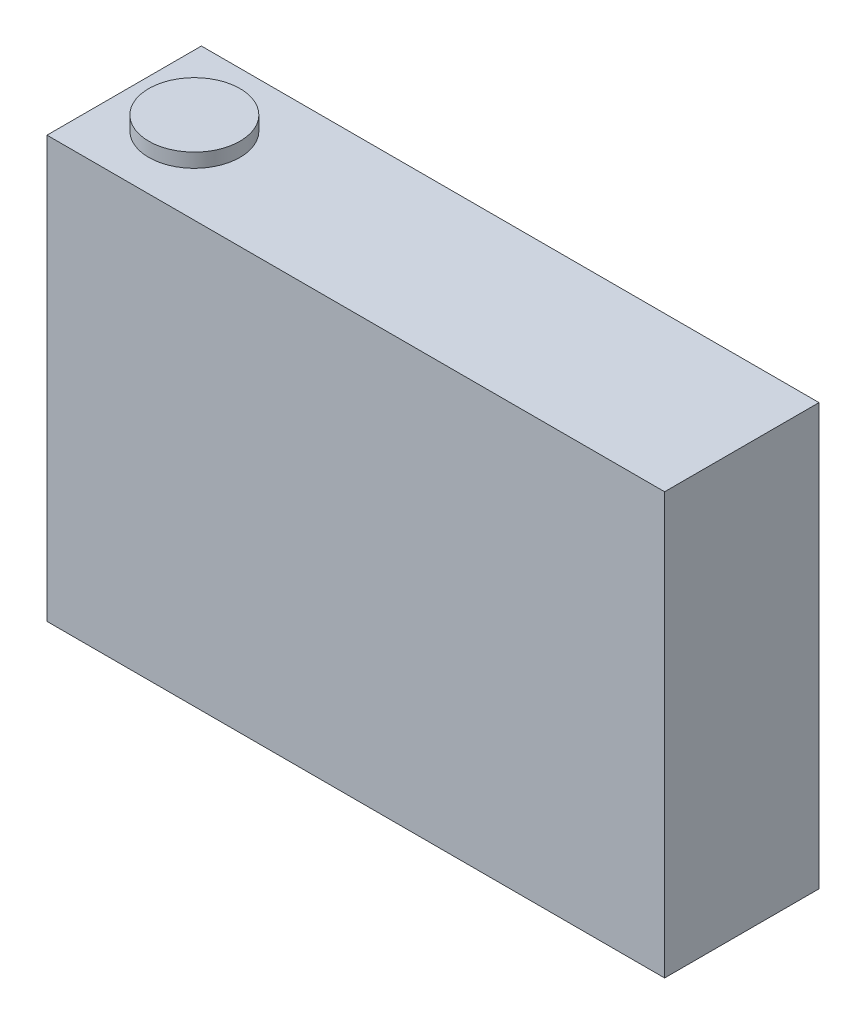
ISO-10303-21;
HEADER;
FILE_DESCRIPTION(('STEP AP214'),'2;1');
FILE_NAME('part.step','',(''),(''),'','','');
FILE_SCHEMA(('AUTOMOTIVE_DESIGN { 1 0 10303 214 1 1 1 1 }'));
ENDSEC;
DATA;
#1=APPLICATION_CONTEXT('core data for automotive mechanical design processes');
#2=APPLICATION_PROTOCOL_DEFINITION('international standard','automotive_design',2000,#1);
#3=PRODUCT_CONTEXT('',#1,'mechanical');
#4=PRODUCT('Part','Part','',(#3));
#5=PRODUCT_RELATED_PRODUCT_CATEGORY('part','',(#4));
#6=PRODUCT_DEFINITION_FORMATION('','',#4);
#7=PRODUCT_DEFINITION_CONTEXT('part definition',#1,'design');
#8=PRODUCT_DEFINITION('design','',#6,#7);
#9=PRODUCT_DEFINITION_SHAPE('','',#8);
#10=(LENGTH_UNIT() NAMED_UNIT(*) SI_UNIT(.MILLI.,.METRE.));
#11=(NAMED_UNIT(*) PLANE_ANGLE_UNIT() SI_UNIT($,.RADIAN.));
#12=(NAMED_UNIT(*) SI_UNIT($,.STERADIAN.) SOLID_ANGLE_UNIT());
#13=UNCERTAINTY_MEASURE_WITH_UNIT(LENGTH_MEASURE(1.E-05),#10,'distance_accuracy_value','');
#14=(GEOMETRIC_REPRESENTATION_CONTEXT(3) GLOBAL_UNCERTAINTY_ASSIGNED_CONTEXT((#13)) GLOBAL_UNIT_ASSIGNED_CONTEXT((#10,
#11,#12)) REPRESENTATION_CONTEXT('',''));
#15=CARTESIAN_POINT('',(0.,0.,0.));
#16=DIRECTION('',(0.,0.,1.));
#17=DIRECTION('',(1.,0.,0.));
#18=AXIS2_PLACEMENT_3D('',#15,#16,#17);
#19=CARTESIAN_POINT('',(0.,60.,0.));
#20=DIRECTION('',(0.,-1.,0.));
#21=DIRECTION('',(0.,0.,-1.));
#22=AXIS2_PLACEMENT_3D('',#19,#20,#21);
#23=PLANE('',#22);
#24=DIRECTION('',(0.,0.,-1.));
#25=VECTOR('',#24,1.);
#26=CARTESIAN_POINT('',(44.,60.,11.));
#27=LINE('',#26,#25);
#28=CARTESIAN_POINT('',(44.,60.,11.));
#29=VERTEX_POINT('',#28);
#30=CARTESIAN_POINT('',(44.,60.,-11.));
#31=VERTEX_POINT('',#30);
#32=EDGE_CURVE('E97',#29,#31,#27,.T.);
#33=ORIENTED_EDGE('',*,*,#32,.T.);
#34=DIRECTION('',(-1.,0.,0.));
#35=VECTOR('',#34,1.);
#36=CARTESIAN_POINT('',(-44.,60.,-11.));
#37=LINE('',#36,#35);
#38=CARTESIAN_POINT('',(-44.,60.,-11.));
#39=VERTEX_POINT('',#38);
#40=EDGE_CURVE('E93',#31,#39,#37,.T.);
#41=ORIENTED_EDGE('',*,*,#40,.T.);
#42=DIRECTION('',(0.,0.,1.));
#43=VECTOR('',#42,1.);
#44=CARTESIAN_POINT('',(-44.,60.,11.));
#45=LINE('',#44,#43);
#46=CARTESIAN_POINT('',(-44.,60.,11.));
#47=VERTEX_POINT('',#46);
#48=EDGE_CURVE('E96',#39,#47,#45,.T.);
#49=ORIENTED_EDGE('',*,*,#48,.T.);
#50=DIRECTION('',(1.,0.,0.));
#51=VECTOR('',#50,1.);
#52=CARTESIAN_POINT('',(-44.,60.,11.));
#53=LINE('',#52,#51);
#54=EDGE_CURVE('E61',#47,#29,#53,.T.);
#55=ORIENTED_EDGE('',*,*,#54,.T.);
#56=EDGE_LOOP('',(#33,#41,#49,#55));
#57=FACE_BOUND('',#56,.T.);
#58=CARTESIAN_POINT('',(-34.,60.,0.));
#59=DIRECTION('',(0.,1.,0.));
#60=DIRECTION('',(0.,0.,1.));
#61=AXIS2_PLACEMENT_3D('',#58,#59,#60);
#62=CIRCLE('',#61,6.5);
#63=CARTESIAN_POINT('',(-34.,60.,6.5));
#64=VERTEX_POINT('',#63);
#65=EDGE_CURVE('E116',#64,#64,#62,.T.);
#66=ORIENTED_EDGE('',*,*,#65,.F.);
#67=EDGE_LOOP('',(#66));
#68=FACE_BOUND('',#67,.T.);
#69=ADVANCED_FACE('F44',(#57,#68),#23,.F.);
#70=CARTESIAN_POINT('',(0.,0.,0.));
#71=DIRECTION('',(0.,-1.,0.));
#72=DIRECTION('',(0.,0.,-1.));
#73=AXIS2_PLACEMENT_3D('',#70,#71,#72);
#74=PLANE('',#73);
#75=DIRECTION('',(0.,0.,-1.));
#76=VECTOR('',#75,1.);
#77=CARTESIAN_POINT('',(44.,0.,11.));
#78=LINE('',#77,#76);
#79=CARTESIAN_POINT('',(44.,0.,11.));
#80=VERTEX_POINT('',#79);
#81=CARTESIAN_POINT('',(44.,0.,-11.));
#82=VERTEX_POINT('',#81);
#83=EDGE_CURVE('E114',#80,#82,#78,.T.);
#84=ORIENTED_EDGE('',*,*,#83,.F.);
#85=DIRECTION('',(1.,0.,0.));
#86=VECTOR('',#85,1.);
#87=CARTESIAN_POINT('',(-44.,0.,11.));
#88=LINE('',#87,#86);
#89=CARTESIAN_POINT('',(-44.,0.,11.));
#90=VERTEX_POINT('',#89);
#91=EDGE_CURVE('E86',#90,#80,#88,.T.);
#92=ORIENTED_EDGE('',*,*,#91,.F.);
#93=DIRECTION('',(0.,0.,1.));
#94=VECTOR('',#93,1.);
#95=CARTESIAN_POINT('',(-44.,0.,11.));
#96=LINE('',#95,#94);
#97=CARTESIAN_POINT('',(-44.,0.,-11.));
#98=VERTEX_POINT('',#97);
#99=EDGE_CURVE('E79',#98,#90,#96,.T.);
#100=ORIENTED_EDGE('',*,*,#99,.F.);
#101=DIRECTION('',(-1.,0.,0.));
#102=VECTOR('',#101,1.);
#103=CARTESIAN_POINT('',(-44.,0.,-11.));
#104=LINE('',#103,#102);
#105=EDGE_CURVE('E104',#82,#98,#104,.T.);
#106=ORIENTED_EDGE('',*,*,#105,.F.);
#107=EDGE_LOOP('',(#84,#92,#100,#106));
#108=FACE_BOUND('',#107,.T.);
#109=ADVANCED_FACE('F131',(#108),#74,.T.);
#110=CARTESIAN_POINT('',(44.,60.,11.));
#111=DIRECTION('',(-1.,0.,0.));
#112=DIRECTION('',(0.,0.,1.));
#113=AXIS2_PLACEMENT_3D('',#110,#111,#112);
#114=PLANE('',#113);
#115=ORIENTED_EDGE('',*,*,#83,.T.);
#116=DIRECTION('',(0.,-1.,0.));
#117=VECTOR('',#116,1.);
#118=CARTESIAN_POINT('',(44.,60.,-11.));
#119=LINE('',#118,#117);
#120=EDGE_CURVE('E11',#31,#82,#119,.T.);
#121=ORIENTED_EDGE('',*,*,#120,.F.);
#122=ORIENTED_EDGE('',*,*,#32,.F.);
#123=DIRECTION('',(0.,-1.,0.));
#124=VECTOR('',#123,1.);
#125=CARTESIAN_POINT('',(44.,60.,11.));
#126=LINE('',#125,#124);
#127=EDGE_CURVE('E109',#29,#80,#126,.T.);
#128=ORIENTED_EDGE('',*,*,#127,.T.);
#129=EDGE_LOOP('',(#115,#121,#122,#128));
#130=FACE_BOUND('',#129,.T.);
#131=ADVANCED_FACE('F50',(#130),#114,.F.);
#132=CARTESIAN_POINT('',(-44.,60.,-11.));
#133=DIRECTION('',(0.,0.,1.));
#134=DIRECTION('',(1.,0.,0.));
#135=AXIS2_PLACEMENT_3D('',#132,#133,#134);
#136=PLANE('',#135);
#137=ORIENTED_EDGE('',*,*,#105,.T.);
#138=DIRECTION('',(0.,-1.,0.));
#139=VECTOR('',#138,1.);
#140=CARTESIAN_POINT('',(-44.,60.,-11.));
#141=LINE('',#140,#139);
#142=EDGE_CURVE('E54',#39,#98,#141,.T.);
#143=ORIENTED_EDGE('',*,*,#142,.F.);
#144=ORIENTED_EDGE('',*,*,#40,.F.);
#145=ORIENTED_EDGE('',*,*,#120,.T.);
#146=EDGE_LOOP('',(#137,#143,#144,#145));
#147=FACE_BOUND('',#146,.T.);
#148=ADVANCED_FACE('F105',(#147),#136,.F.);
#149=CARTESIAN_POINT('',(-44.,60.,11.));
#150=DIRECTION('',(1.,0.,0.));
#151=DIRECTION('',(0.,0.,-1.));
#152=AXIS2_PLACEMENT_3D('',#149,#150,#151);
#153=PLANE('',#152);
#154=ORIENTED_EDGE('',*,*,#99,.T.);
#155=DIRECTION('',(0.,-1.,0.));
#156=VECTOR('',#155,1.);
#157=CARTESIAN_POINT('',(-44.,60.,11.));
#158=LINE('',#157,#156);
#159=EDGE_CURVE('E103',#47,#90,#158,.T.);
#160=ORIENTED_EDGE('',*,*,#159,.F.);
#161=ORIENTED_EDGE('',*,*,#48,.F.);
#162=ORIENTED_EDGE('',*,*,#142,.T.);
#163=EDGE_LOOP('',(#154,#160,#161,#162));
#164=FACE_BOUND('',#163,.T.);
#165=ADVANCED_FACE('F108',(#164),#153,.F.);
#166=CARTESIAN_POINT('',(-44.,60.,11.));
#167=DIRECTION('',(0.,0.,-1.));
#168=DIRECTION('',(-1.,0.,0.));
#169=AXIS2_PLACEMENT_3D('',#166,#167,#168);
#170=PLANE('',#169);
#171=ORIENTED_EDGE('',*,*,#91,.T.);
#172=ORIENTED_EDGE('',*,*,#127,.F.);
#173=ORIENTED_EDGE('',*,*,#54,.F.);
#174=ORIENTED_EDGE('',*,*,#159,.T.);
#175=EDGE_LOOP('',(#171,#172,#173,#174));
#176=FACE_BOUND('',#175,.T.);
#177=ADVANCED_FACE('F126',(#176),#170,.F.);
#178=CARTESIAN_POINT('',(-34.,62.,0.));
#179=DIRECTION('',(0.,-1.,0.));
#180=DIRECTION('',(0.,0.,-1.));
#181=AXIS2_PLACEMENT_3D('',#178,#179,#180);
#182=CYLINDRICAL_SURFACE('',#181,6.5);
#183=CARTESIAN_POINT('',(-34.,62.,0.));
#184=DIRECTION('',(0.,1.,0.));
#185=DIRECTION('',(0.,0.,1.));
#186=AXIS2_PLACEMENT_3D('',#183,#184,#185);
#187=CIRCLE('',#186,6.5);
#188=CARTESIAN_POINT('',(-34.,62.,6.5));
#189=VERTEX_POINT('',#188);
#190=EDGE_CURVE('E138',#189,#189,#187,.T.);
#191=ORIENTED_EDGE('',*,*,#190,.F.);
#192=EDGE_LOOP('',(#191));
#193=FACE_BOUND('',#192,.T.);
#194=ORIENTED_EDGE('',*,*,#65,.T.);
#195=EDGE_LOOP('',(#194));
#196=FACE_BOUND('',#195,.T.);
#197=ADVANCED_FACE('F144',(#193,#196),#182,.T.);
#198=CARTESIAN_POINT('',(-34.,62.,0.));
#199=DIRECTION('',(0.,1.,0.));
#200=DIRECTION('',(0.,0.,1.));
#201=AXIS2_PLACEMENT_3D('',#198,#199,#200);
#202=PLANE('',#201);
#203=ORIENTED_EDGE('',*,*,#190,.T.);
#204=EDGE_LOOP('',(#203));
#205=FACE_BOUND('',#204,.T.);
#206=ADVANCED_FACE('F142',(#205),#202,.T.);
#207=CLOSED_SHELL('',(#69,#109,#131,#148,#165,#177,#197,#206));
#208=MANIFOLD_SOLID_BREP('B2',#207);
#209=ADVANCED_BREP_SHAPE_REPRESENTATION('',(#18,#208),#14);
#210=SHAPE_DEFINITION_REPRESENTATION(#9,#209);
ENDSEC;
END-ISO-10303-21;
